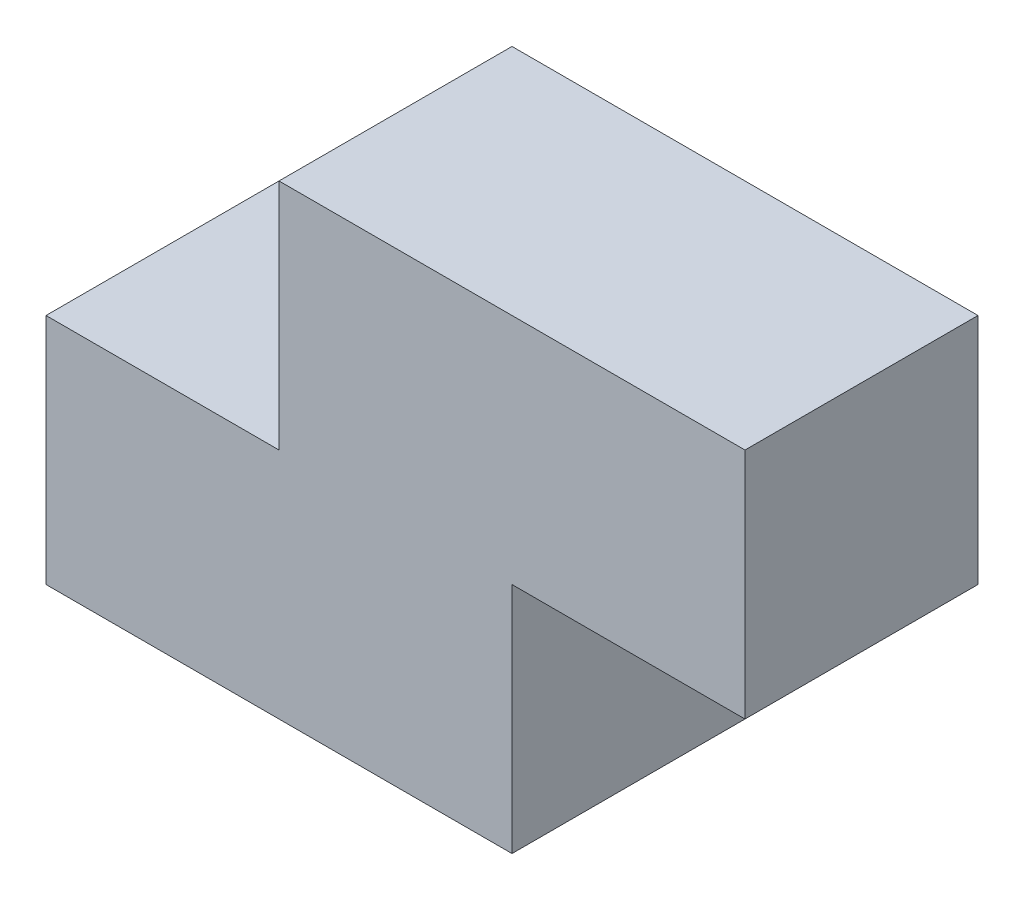
ISO-10303-21;
HEADER;
FILE_DESCRIPTION(('STEP AP214'),'2;1');
FILE_NAME('part.step','',(''),(''),'','','');
FILE_SCHEMA(('AUTOMOTIVE_DESIGN { 1 0 10303 214 1 1 1 1 }'));
ENDSEC;
DATA;
#1=APPLICATION_CONTEXT('core data for automotive mechanical design processes');
#2=APPLICATION_PROTOCOL_DEFINITION('international standard','automotive_design',2000,#1);
#3=PRODUCT_CONTEXT('',#1,'mechanical');
#4=PRODUCT('Part','Part','',(#3));
#5=PRODUCT_RELATED_PRODUCT_CATEGORY('part','',(#4));
#6=PRODUCT_DEFINITION_FORMATION('','',#4);
#7=PRODUCT_DEFINITION_CONTEXT('part definition',#1,'design');
#8=PRODUCT_DEFINITION('design','',#6,#7);
#9=PRODUCT_DEFINITION_SHAPE('','',#8);
#10=(LENGTH_UNIT() NAMED_UNIT(*) SI_UNIT(.MILLI.,.METRE.));
#11=(NAMED_UNIT(*) PLANE_ANGLE_UNIT() SI_UNIT($,.RADIAN.));
#12=(NAMED_UNIT(*) SI_UNIT($,.STERADIAN.) SOLID_ANGLE_UNIT());
#13=UNCERTAINTY_MEASURE_WITH_UNIT(LENGTH_MEASURE(1.E-05),#10,'distance_accuracy_value','');
#14=(GEOMETRIC_REPRESENTATION_CONTEXT(3) GLOBAL_UNCERTAINTY_ASSIGNED_CONTEXT((#13)) GLOBAL_UNIT_ASSIGNED_CONTEXT((#10,
#11,#12)) REPRESENTATION_CONTEXT('',''));
#15=CARTESIAN_POINT('',(0.,0.,0.));
#16=DIRECTION('',(0.,0.,1.));
#17=DIRECTION('',(1.,0.,0.));
#18=AXIS2_PLACEMENT_3D('',#15,#16,#17);
#19=CARTESIAN_POINT('',(60.,30.,0.));
#20=DIRECTION('',(-1.,0.,0.));
#21=DIRECTION('',(0.,0.,1.));
#22=AXIS2_PLACEMENT_3D('',#19,#20,#21);
#23=PLANE('',#22);
#24=DIRECTION('',(0.,0.,-1.));
#25=VECTOR('',#24,1.);
#26=CARTESIAN_POINT('',(60.,30.,0.));
#27=LINE('',#26,#25);
#28=CARTESIAN_POINT('',(60.,30.,30.));
#29=VERTEX_POINT('',#28);
#30=CARTESIAN_POINT('',(60.,30.,0.));
#31=VERTEX_POINT('',#30);
#32=EDGE_CURVE('E48',#29,#31,#27,.T.);
#33=ORIENTED_EDGE('',*,*,#32,.F.);
#34=DIRECTION('',(0.,-1.,0.));
#35=VECTOR('',#34,1.);
#36=CARTESIAN_POINT('',(60.,30.,30.));
#37=LINE('',#36,#35);
#38=CARTESIAN_POINT('',(60.,0.,30.));
#39=VERTEX_POINT('',#38);
#40=EDGE_CURVE('E41',#29,#39,#37,.T.);
#41=ORIENTED_EDGE('',*,*,#40,.T.);
#42=DIRECTION('',(0.,0.,-1.));
#43=VECTOR('',#42,1.);
#44=CARTESIAN_POINT('',(60.,0.,0.));
#45=LINE('',#44,#43);
#46=CARTESIAN_POINT('',(60.,0.,0.));
#47=VERTEX_POINT('',#46);
#48=EDGE_CURVE('E152',#39,#47,#45,.T.);
#49=ORIENTED_EDGE('',*,*,#48,.T.);
#50=DIRECTION('',(0.,-1.,0.));
#51=VECTOR('',#50,1.);
#52=CARTESIAN_POINT('',(60.,30.,0.));
#53=LINE('',#52,#51);
#54=EDGE_CURVE('E158',#31,#47,#53,.T.);
#55=ORIENTED_EDGE('',*,*,#54,.F.);
#56=EDGE_LOOP('',(#33,#41,#49,#55));
#57=FACE_BOUND('',#56,.T.);
#58=ADVANCED_FACE('F33',(#57),#23,.F.);
#59=CARTESIAN_POINT('',(0.,30.,0.));
#60=DIRECTION('',(0.,-1.,0.));
#61=DIRECTION('',(0.,0.,-1.));
#62=AXIS2_PLACEMENT_3D('',#59,#60,#61);
#63=PLANE('',#62);
#64=DIRECTION('',(0.,0.,1.));
#65=VECTOR('',#64,1.);
#66=CARTESIAN_POINT('',(30.,30.,0.));
#67=LINE('',#66,#65);
#68=CARTESIAN_POINT('',(30.,30.,0.));
#69=VERTEX_POINT('',#68);
#70=CARTESIAN_POINT('',(30.,30.,30.));
#71=VERTEX_POINT('',#70);
#72=EDGE_CURVE('E56',#69,#71,#67,.T.);
#73=ORIENTED_EDGE('',*,*,#72,.F.);
#74=DIRECTION('',(-1.,0.,0.));
#75=VECTOR('',#74,1.);
#76=CARTESIAN_POINT('',(0.,30.,0.));
#77=LINE('',#76,#75);
#78=CARTESIAN_POINT('',(0.,30.,0.));
#79=VERTEX_POINT('',#78);
#80=EDGE_CURVE('E145',#69,#79,#77,.T.);
#81=ORIENTED_EDGE('',*,*,#80,.T.);
#82=DIRECTION('',(0.,0.,1.));
#83=VECTOR('',#82,1.);
#84=CARTESIAN_POINT('',(0.,30.,30.));
#85=LINE('',#84,#83);
#86=CARTESIAN_POINT('',(0.,30.,30.));
#87=VERTEX_POINT('',#86);
#88=EDGE_CURVE('E139',#79,#87,#85,.T.);
#89=ORIENTED_EDGE('',*,*,#88,.T.);
#90=DIRECTION('',(1.,0.,0.));
#91=VECTOR('',#90,1.);
#92=CARTESIAN_POINT('',(60.,30.,30.));
#93=LINE('',#92,#91);
#94=EDGE_CURVE('E142',#87,#71,#93,.T.);
#95=ORIENTED_EDGE('',*,*,#94,.T.);
#96=EDGE_LOOP('',(#73,#81,#89,#95));
#97=FACE_BOUND('',#96,.T.);
#98=ADVANCED_FACE('F170',(#97),#63,.F.);
#99=CARTESIAN_POINT('',(0.,30.,30.));
#100=DIRECTION('',(1.,0.,0.));
#101=DIRECTION('',(0.,0.,-1.));
#102=AXIS2_PLACEMENT_3D('',#99,#100,#101);
#103=PLANE('',#102);
#104=DIRECTION('',(0.,0.,1.));
#105=VECTOR('',#104,1.);
#106=CARTESIAN_POINT('',(0.,0.,30.));
#107=LINE('',#106,#105);
#108=CARTESIAN_POINT('',(0.,0.,0.));
#109=VERTEX_POINT('',#108);
#110=CARTESIAN_POINT('',(0.,0.,30.));
#111=VERTEX_POINT('',#110);
#112=EDGE_CURVE('E138',#109,#111,#107,.T.);
#113=ORIENTED_EDGE('',*,*,#112,.T.);
#114=DIRECTION('',(0.,-1.,0.));
#115=VECTOR('',#114,1.);
#116=CARTESIAN_POINT('',(0.,30.,30.));
#117=LINE('',#116,#115);
#118=EDGE_CURVE('E11',#87,#111,#117,.T.);
#119=ORIENTED_EDGE('',*,*,#118,.F.);
#120=ORIENTED_EDGE('',*,*,#88,.F.);
#121=DIRECTION('',(0.,-1.,0.));
#122=VECTOR('',#121,1.);
#123=CARTESIAN_POINT('',(0.,30.,0.));
#124=LINE('',#123,#122);
#125=EDGE_CURVE('E147',#79,#109,#124,.T.);
#126=ORIENTED_EDGE('',*,*,#125,.T.);
#127=EDGE_LOOP('',(#113,#119,#120,#126));
#128=FACE_BOUND('',#127,.T.);
#129=ADVANCED_FACE('F35',(#128),#103,.F.);
#130=CARTESIAN_POINT('',(60.,30.,30.));
#131=DIRECTION('',(0.,0.,-1.));
#132=DIRECTION('',(-1.,0.,0.));
#133=AXIS2_PLACEMENT_3D('',#130,#131,#132);
#134=PLANE('',#133);
#135=DIRECTION('',(1.,0.,0.));
#136=VECTOR('',#135,1.);
#137=CARTESIAN_POINT('',(60.,0.,30.));
#138=LINE('',#137,#136);
#139=EDGE_CURVE('E150',#111,#39,#138,.T.);
#140=ORIENTED_EDGE('',*,*,#139,.T.);
#141=ORIENTED_EDGE('',*,*,#40,.F.);
#142=DIRECTION('',(-1.,0.,0.));
#143=VECTOR('',#142,1.);
#144=CARTESIAN_POINT('',(90.,30.,30.));
#145=LINE('',#144,#143);
#146=CARTESIAN_POINT('',(90.,30.,30.));
#147=VERTEX_POINT('',#146);
#148=EDGE_CURVE('E102',#147,#29,#145,.T.);
#149=ORIENTED_EDGE('',*,*,#148,.F.);
#150=DIRECTION('',(0.,-1.,0.));
#151=VECTOR('',#150,1.);
#152=CARTESIAN_POINT('',(90.,30.,30.));
#153=LINE('',#152,#151);
#154=CARTESIAN_POINT('',(90.,60.,30.));
#155=VERTEX_POINT('',#154);
#156=EDGE_CURVE('E109',#155,#147,#153,.T.);
#157=ORIENTED_EDGE('',*,*,#156,.F.);
#158=DIRECTION('',(1.,0.,0.));
#159=VECTOR('',#158,1.);
#160=CARTESIAN_POINT('',(30.,60.,30.));
#161=LINE('',#160,#159);
#162=CARTESIAN_POINT('',(30.,60.,30.));
#163=VERTEX_POINT('',#162);
#164=EDGE_CURVE('E130',#163,#155,#161,.T.);
#165=ORIENTED_EDGE('',*,*,#164,.F.);
#166=DIRECTION('',(0.,-1.,0.));
#167=VECTOR('',#166,1.);
#168=CARTESIAN_POINT('',(30.,60.,30.));
#169=LINE('',#168,#167);
#170=EDGE_CURVE('E131',#163,#71,#169,.T.);
#171=ORIENTED_EDGE('',*,*,#170,.T.);
#172=ORIENTED_EDGE('',*,*,#94,.F.);
#173=ORIENTED_EDGE('',*,*,#118,.T.);
#174=EDGE_LOOP('',(#140,#141,#149,#157,#165,#171,#172,#173));
#175=FACE_BOUND('',#174,.T.);
#176=ADVANCED_FACE('F120',(#175),#134,.F.);
#177=CARTESIAN_POINT('',(0.,30.,0.));
#178=DIRECTION('',(0.,0.,1.));
#179=DIRECTION('',(1.,0.,0.));
#180=AXIS2_PLACEMENT_3D('',#177,#178,#179);
#181=PLANE('',#180);
#182=DIRECTION('',(-1.,0.,0.));
#183=VECTOR('',#182,1.);
#184=CARTESIAN_POINT('',(0.,0.,0.));
#185=LINE('',#184,#183);
#186=EDGE_CURVE('E143',#47,#109,#185,.T.);
#187=ORIENTED_EDGE('',*,*,#186,.T.);
#188=ORIENTED_EDGE('',*,*,#125,.F.);
#189=ORIENTED_EDGE('',*,*,#80,.F.);
#190=DIRECTION('',(0.,-1.,0.));
#191=VECTOR('',#190,1.);
#192=CARTESIAN_POINT('',(30.,60.,0.));
#193=LINE('',#192,#191);
#194=CARTESIAN_POINT('',(30.,60.,0.));
#195=VERTEX_POINT('',#194);
#196=EDGE_CURVE('E135',#195,#69,#193,.T.);
#197=ORIENTED_EDGE('',*,*,#196,.F.);
#198=DIRECTION('',(-1.,0.,0.));
#199=VECTOR('',#198,1.);
#200=CARTESIAN_POINT('',(60.,60.,0.));
#201=LINE('',#200,#199);
#202=CARTESIAN_POINT('',(90.,60.,0.));
#203=VERTEX_POINT('',#202);
#204=EDGE_CURVE('E122',#203,#195,#201,.T.);
#205=ORIENTED_EDGE('',*,*,#204,.F.);
#206=DIRECTION('',(0.,1.,0.));
#207=VECTOR('',#206,1.);
#208=CARTESIAN_POINT('',(90.,60.,0.));
#209=LINE('',#208,#207);
#210=CARTESIAN_POINT('',(90.,30.,0.));
#211=VERTEX_POINT('',#210);
#212=EDGE_CURVE('E108',#211,#203,#209,.T.);
#213=ORIENTED_EDGE('',*,*,#212,.F.);
#214=DIRECTION('',(-1.,0.,0.));
#215=VECTOR('',#214,1.);
#216=CARTESIAN_POINT('',(90.,30.,0.));
#217=LINE('',#216,#215);
#218=EDGE_CURVE('E104',#211,#31,#217,.T.);
#219=ORIENTED_EDGE('',*,*,#218,.T.);
#220=ORIENTED_EDGE('',*,*,#54,.T.);
#221=EDGE_LOOP('',(#187,#188,#189,#197,#205,#213,#219,#220));
#222=FACE_BOUND('',#221,.T.);
#223=ADVANCED_FACE('F167',(#222),#181,.F.);
#224=CARTESIAN_POINT('',(0.,0.,0.));
#225=DIRECTION('',(0.,-1.,0.));
#226=DIRECTION('',(0.,0.,-1.));
#227=AXIS2_PLACEMENT_3D('',#224,#225,#226);
#228=PLANE('',#227);
#229=ORIENTED_EDGE('',*,*,#112,.F.);
#230=ORIENTED_EDGE('',*,*,#186,.F.);
#231=ORIENTED_EDGE('',*,*,#48,.F.);
#232=ORIENTED_EDGE('',*,*,#139,.F.);
#233=EDGE_LOOP('',(#229,#230,#231,#232));
#234=FACE_BOUND('',#233,.T.);
#235=ADVANCED_FACE('F164',(#234),#228,.T.);
#236=CARTESIAN_POINT('',(30.,60.,0.));
#237=DIRECTION('',(1.,0.,0.));
#238=DIRECTION('',(0.,0.,-1.));
#239=AXIS2_PLACEMENT_3D('',#236,#237,#238);
#240=PLANE('',#239);
#241=ORIENTED_EDGE('',*,*,#72,.T.);
#242=ORIENTED_EDGE('',*,*,#170,.F.);
#243=DIRECTION('',(0.,0.,1.));
#244=VECTOR('',#243,1.);
#245=CARTESIAN_POINT('',(30.,60.,0.));
#246=LINE('',#245,#244);
#247=EDGE_CURVE('E128',#195,#163,#246,.T.);
#248=ORIENTED_EDGE('',*,*,#247,.F.);
#249=ORIENTED_EDGE('',*,*,#196,.T.);
#250=EDGE_LOOP('',(#241,#242,#248,#249));
#251=FACE_BOUND('',#250,.T.);
#252=ADVANCED_FACE('F174',(#251),#240,.F.);
#253=CARTESIAN_POINT('',(0.,60.,0.));
#254=DIRECTION('',(0.,1.,0.));
#255=DIRECTION('',(0.,0.,1.));
#256=AXIS2_PLACEMENT_3D('',#253,#254,#255);
#257=PLANE('',#256);
#258=ORIENTED_EDGE('',*,*,#164,.T.);
#259=DIRECTION('',(0.,0.,1.));
#260=VECTOR('',#259,1.);
#261=CARTESIAN_POINT('',(90.,60.,30.));
#262=LINE('',#261,#260);
#263=EDGE_CURVE('E115',#203,#155,#262,.T.);
#264=ORIENTED_EDGE('',*,*,#263,.F.);
#265=ORIENTED_EDGE('',*,*,#204,.T.);
#266=ORIENTED_EDGE('',*,*,#247,.T.);
#267=EDGE_LOOP('',(#258,#264,#265,#266));
#268=FACE_BOUND('',#267,.T.);
#269=ADVANCED_FACE('F177',(#268),#257,.T.);
#270=CARTESIAN_POINT('',(90.,30.,0.));
#271=DIRECTION('',(0.,1.,0.));
#272=DIRECTION('',(0.,0.,1.));
#273=AXIS2_PLACEMENT_3D('',#270,#271,#272);
#274=PLANE('',#273);
#275=ORIENTED_EDGE('',*,*,#32,.T.);
#276=ORIENTED_EDGE('',*,*,#218,.F.);
#277=DIRECTION('',(0.,0.,-1.));
#278=VECTOR('',#277,1.);
#279=CARTESIAN_POINT('',(90.,30.,0.));
#280=LINE('',#279,#278);
#281=EDGE_CURVE('E98',#147,#211,#280,.T.);
#282=ORIENTED_EDGE('',*,*,#281,.F.);
#283=ORIENTED_EDGE('',*,*,#148,.T.);
#284=EDGE_LOOP('',(#275,#276,#282,#283));
#285=FACE_BOUND('',#284,.T.);
#286=ADVANCED_FACE('F100',(#285),#274,.F.);
#287=CARTESIAN_POINT('',(90.,0.,0.));
#288=DIRECTION('',(-1.,0.,0.));
#289=DIRECTION('',(0.,0.,1.));
#290=AXIS2_PLACEMENT_3D('',#287,#288,#289);
#291=PLANE('',#290);
#292=ORIENTED_EDGE('',*,*,#156,.T.);
#293=ORIENTED_EDGE('',*,*,#281,.T.);
#294=ORIENTED_EDGE('',*,*,#212,.T.);
#295=ORIENTED_EDGE('',*,*,#263,.T.);
#296=EDGE_LOOP('',(#292,#293,#294,#295));
#297=FACE_BOUND('',#296,.T.);
#298=ADVANCED_FACE('F113',(#297),#291,.F.);
#299=CLOSED_SHELL('',(#58,#98,#129,#176,#223,#235,#252,#269,#286,#298));
#300=MANIFOLD_SOLID_BREP('B2',#299);
#301=ADVANCED_BREP_SHAPE_REPRESENTATION('',(#18,#300),#14);
#302=SHAPE_DEFINITION_REPRESENTATION(#9,#301);
ENDSEC;
END-ISO-10303-21;
